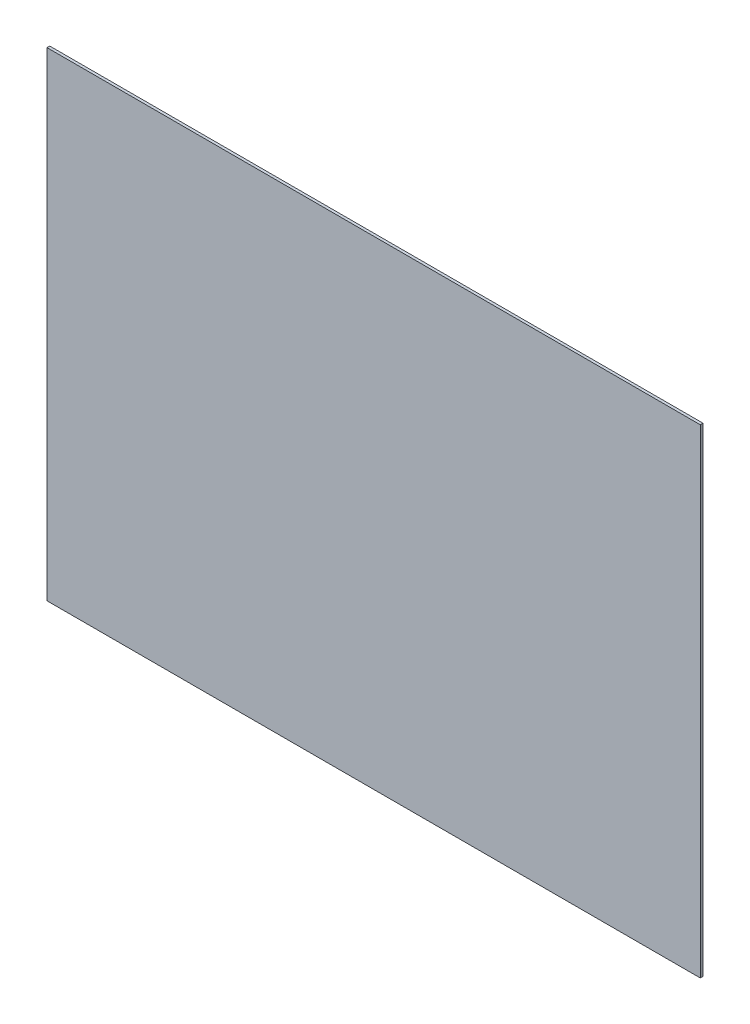
ISO-10303-21;
HEADER;
FILE_DESCRIPTION(('STEP AP214'),'2;1');
FILE_NAME('part.step','',(''),(''),'','','');
FILE_SCHEMA(('AUTOMOTIVE_DESIGN { 1 0 10303 214 1 1 1 1 }'));
ENDSEC;
DATA;
#1=APPLICATION_CONTEXT('core data for automotive mechanical design processes');
#2=APPLICATION_PROTOCOL_DEFINITION('international standard','automotive_design',2000,#1);
#3=PRODUCT_CONTEXT('',#1,'mechanical');
#4=PRODUCT('Part','Part','',(#3));
#5=PRODUCT_RELATED_PRODUCT_CATEGORY('part','',(#4));
#6=PRODUCT_DEFINITION_FORMATION('','',#4);
#7=PRODUCT_DEFINITION_CONTEXT('part definition',#1,'design');
#8=PRODUCT_DEFINITION('design','',#6,#7);
#9=PRODUCT_DEFINITION_SHAPE('','',#8);
#10=(LENGTH_UNIT() NAMED_UNIT(*) SI_UNIT(.MILLI.,.METRE.));
#11=(NAMED_UNIT(*) PLANE_ANGLE_UNIT() SI_UNIT($,.RADIAN.));
#12=(NAMED_UNIT(*) SI_UNIT($,.STERADIAN.) SOLID_ANGLE_UNIT());
#13=UNCERTAINTY_MEASURE_WITH_UNIT(LENGTH_MEASURE(1.E-05),#10,'distance_accuracy_value','');
#14=(GEOMETRIC_REPRESENTATION_CONTEXT(3) GLOBAL_UNCERTAINTY_ASSIGNED_CONTEXT((#13)) GLOBAL_UNIT_ASSIGNED_CONTEXT((#10,
#11,#12)) REPRESENTATION_CONTEXT('',''));
#15=CARTESIAN_POINT('',(0.,0.,0.));
#16=DIRECTION('',(0.,0.,1.));
#17=DIRECTION('',(1.,0.,0.));
#18=AXIS2_PLACEMENT_3D('',#15,#16,#17);
#19=CARTESIAN_POINT('',(0.,0.,1.5875));
#20=DIRECTION('',(1.,0.,0.));
#21=DIRECTION('',(0.,1.,0.));
#22=AXIS2_PLACEMENT_3D('',#19,#20,#21);
#23=PLANE('',#22);
#24=DIRECTION('',(0.,-1.,0.));
#25=VECTOR('',#24,1.);
#26=CARTESIAN_POINT('',(0.,0.,0.));
#27=LINE('',#26,#25);
#28=CARTESIAN_POINT('',(-1.11022302462516E-13,279.4,0.));
#29=VERTEX_POINT('',#28);
#30=CARTESIAN_POINT('',(0.,0.,0.));
#31=VERTEX_POINT('',#30);
#32=EDGE_CURVE('E107',#29,#31,#27,.T.);
#33=ORIENTED_EDGE('',*,*,#32,.T.);
#34=DIRECTION('',(0.,0.,-1.));
#35=VECTOR('',#34,1.);
#36=CARTESIAN_POINT('',(0.,0.,1.5875));
#37=LINE('',#36,#35);
#38=CARTESIAN_POINT('',(0.,0.,1.5875));
#39=VERTEX_POINT('',#38);
#40=EDGE_CURVE('E11',#39,#31,#37,.T.);
#41=ORIENTED_EDGE('',*,*,#40,.F.);
#42=DIRECTION('',(0.,-1.,0.));
#43=VECTOR('',#42,1.);
#44=CARTESIAN_POINT('',(0.,0.,1.5875));
#45=LINE('',#44,#43);
#46=CARTESIAN_POINT('',(-1.11022302462516E-13,279.4,1.5875));
#47=VERTEX_POINT('',#46);
#48=EDGE_CURVE('E91',#47,#39,#45,.T.);
#49=ORIENTED_EDGE('',*,*,#48,.F.);
#50=DIRECTION('',(0.,0.,-1.));
#51=VECTOR('',#50,1.);
#52=CARTESIAN_POINT('',(-1.11022302462516E-13,279.4,1.5875));
#53=LINE('',#52,#51);
#54=EDGE_CURVE('E103',#47,#29,#53,.T.);
#55=ORIENTED_EDGE('',*,*,#54,.T.);
#56=EDGE_LOOP('',(#33,#41,#49,#55));
#57=FACE_BOUND('',#56,.T.);
#58=ADVANCED_FACE('F39',(#57),#23,.F.);
#59=CARTESIAN_POINT('',(0.,0.,1.5875));
#60=DIRECTION('',(0.,1.,0.));
#61=DIRECTION('',(0.,0.,1.));
#62=AXIS2_PLACEMENT_3D('',#59,#60,#61);
#63=PLANE('',#62);
#64=DIRECTION('',(1.,0.,0.));
#65=VECTOR('',#64,1.);
#66=CARTESIAN_POINT('',(0.,0.,0.));
#67=LINE('',#66,#65);
#68=CARTESIAN_POINT('',(381.,0.,0.));
#69=VERTEX_POINT('',#68);
#70=EDGE_CURVE('E96',#31,#69,#67,.T.);
#71=ORIENTED_EDGE('',*,*,#70,.T.);
#72=DIRECTION('',(0.,0.,-1.));
#73=VECTOR('',#72,1.);
#74=CARTESIAN_POINT('',(381.,0.,1.5875));
#75=LINE('',#74,#73);
#76=CARTESIAN_POINT('',(381.,0.,1.5875));
#77=VERTEX_POINT('',#76);
#78=EDGE_CURVE('E48',#77,#69,#75,.T.);
#79=ORIENTED_EDGE('',*,*,#78,.F.);
#80=DIRECTION('',(1.,0.,0.));
#81=VECTOR('',#80,1.);
#82=CARTESIAN_POINT('',(0.,0.,1.5875));
#83=LINE('',#82,#81);
#84=EDGE_CURVE('E86',#39,#77,#83,.T.);
#85=ORIENTED_EDGE('',*,*,#84,.F.);
#86=ORIENTED_EDGE('',*,*,#40,.T.);
#87=EDGE_LOOP('',(#71,#79,#85,#86));
#88=FACE_BOUND('',#87,.T.);
#89=ADVANCED_FACE('F95',(#88),#63,.F.);
#90=CARTESIAN_POINT('',(381.,0.,1.5875));
#91=DIRECTION('',(-1.,0.,0.));
#92=DIRECTION('',(0.,-1.,0.));
#93=AXIS2_PLACEMENT_3D('',#90,#91,#92);
#94=PLANE('',#93);
#95=DIRECTION('',(0.,1.,0.));
#96=VECTOR('',#95,1.);
#97=CARTESIAN_POINT('',(381.,0.,0.));
#98=LINE('',#97,#96);
#99=CARTESIAN_POINT('',(381.,279.4,0.));
#100=VERTEX_POINT('',#99);
#101=EDGE_CURVE('E73',#69,#100,#98,.T.);
#102=ORIENTED_EDGE('',*,*,#101,.T.);
#103=DIRECTION('',(0.,0.,-1.));
#104=VECTOR('',#103,1.);
#105=CARTESIAN_POINT('',(381.,279.4,1.5875));
#106=LINE('',#105,#104);
#107=CARTESIAN_POINT('',(381.,279.4,1.5875));
#108=VERTEX_POINT('',#107);
#109=EDGE_CURVE('E98',#108,#100,#106,.T.);
#110=ORIENTED_EDGE('',*,*,#109,.F.);
#111=DIRECTION('',(0.,1.,0.));
#112=VECTOR('',#111,1.);
#113=CARTESIAN_POINT('',(381.,0.,1.5875));
#114=LINE('',#113,#112);
#115=EDGE_CURVE('E89',#77,#108,#114,.T.);
#116=ORIENTED_EDGE('',*,*,#115,.F.);
#117=ORIENTED_EDGE('',*,*,#78,.T.);
#118=EDGE_LOOP('',(#102,#110,#116,#117));
#119=FACE_BOUND('',#118,.T.);
#120=ADVANCED_FACE('F99',(#119),#94,.F.);
#121=CARTESIAN_POINT('',(-1.11022302462516E-13,279.4,1.5875));
#122=DIRECTION('',(0.,-1.,0.));
#123=DIRECTION('',(0.,0.,-1.));
#124=AXIS2_PLACEMENT_3D('',#121,#122,#123);
#125=PLANE('',#124);
#126=DIRECTION('',(-1.,0.,0.));
#127=VECTOR('',#126,1.);
#128=CARTESIAN_POINT('',(-1.11022302462516E-13,279.4,0.));
#129=LINE('',#128,#127);
#130=EDGE_CURVE('E79',#100,#29,#129,.T.);
#131=ORIENTED_EDGE('',*,*,#130,.T.);
#132=ORIENTED_EDGE('',*,*,#54,.F.);
#133=DIRECTION('',(-1.,0.,0.));
#134=VECTOR('',#133,1.);
#135=CARTESIAN_POINT('',(-1.11022302462516E-13,279.4,1.5875));
#136=LINE('',#135,#134);
#137=EDGE_CURVE('E56',#108,#47,#136,.T.);
#138=ORIENTED_EDGE('',*,*,#137,.F.);
#139=ORIENTED_EDGE('',*,*,#109,.T.);
#140=EDGE_LOOP('',(#131,#132,#138,#139));
#141=FACE_BOUND('',#140,.T.);
#142=ADVANCED_FACE('F120',(#141),#125,.F.);
#143=CARTESIAN_POINT('',(0.,0.,1.5875));
#144=DIRECTION('',(0.,0.,-1.));
#145=DIRECTION('',(-1.,0.,0.));
#146=AXIS2_PLACEMENT_3D('',#143,#144,#145);
#147=PLANE('',#146);
#148=ORIENTED_EDGE('',*,*,#48,.T.);
#149=ORIENTED_EDGE('',*,*,#84,.T.);
#150=ORIENTED_EDGE('',*,*,#115,.T.);
#151=ORIENTED_EDGE('',*,*,#137,.T.);
#152=EDGE_LOOP('',(#148,#149,#150,#151));
#153=FACE_BOUND('',#152,.T.);
#154=ADVANCED_FACE('F87',(#153),#147,.F.);
#155=CARTESIAN_POINT('',(0.,0.,0.));
#156=DIRECTION('',(0.,0.,-1.));
#157=DIRECTION('',(-1.,0.,0.));
#158=AXIS2_PLACEMENT_3D('',#155,#156,#157);
#159=PLANE('',#158);
#160=ORIENTED_EDGE('',*,*,#32,.F.);
#161=ORIENTED_EDGE('',*,*,#130,.F.);
#162=ORIENTED_EDGE('',*,*,#101,.F.);
#163=ORIENTED_EDGE('',*,*,#70,.F.);
#164=EDGE_LOOP('',(#160,#161,#162,#163));
#165=FACE_BOUND('',#164,.T.);
#166=ADVANCED_FACE('F123',(#165),#159,.T.);
#167=CLOSED_SHELL('',(#58,#89,#120,#142,#154,#166));
#168=MANIFOLD_SOLID_BREP('B2',#167);
#169=ADVANCED_BREP_SHAPE_REPRESENTATION('',(#18,#168),#14);
#170=SHAPE_DEFINITION_REPRESENTATION(#9,#169);
ENDSEC;
END-ISO-10303-21;
